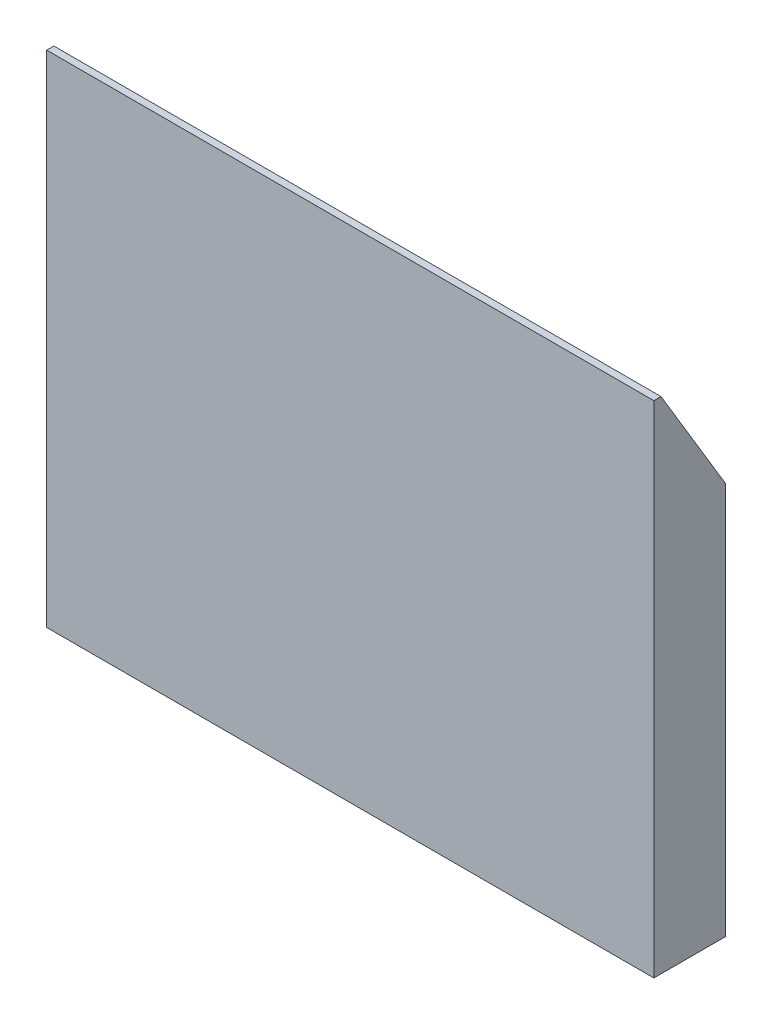
ISO-10303-21;
HEADER;
FILE_DESCRIPTION(('STEP AP214'),'2;1');
FILE_NAME('part.step','',(''),(''),'','','');
FILE_SCHEMA(('AUTOMOTIVE_DESIGN { 1 0 10303 214 1 1 1 1 }'));
ENDSEC;
DATA;
#1=APPLICATION_CONTEXT('core data for automotive mechanical design processes');
#2=APPLICATION_PROTOCOL_DEFINITION('international standard','automotive_design',2000,#1);
#3=PRODUCT_CONTEXT('',#1,'mechanical');
#4=PRODUCT('Part','Part','',(#3));
#5=PRODUCT_RELATED_PRODUCT_CATEGORY('part','',(#4));
#6=PRODUCT_DEFINITION_FORMATION('','',#4);
#7=PRODUCT_DEFINITION_CONTEXT('part definition',#1,'design');
#8=PRODUCT_DEFINITION('design','',#6,#7);
#9=PRODUCT_DEFINITION_SHAPE('','',#8);
#10=(LENGTH_UNIT() NAMED_UNIT(*) SI_UNIT(.MILLI.,.METRE.));
#11=(NAMED_UNIT(*) PLANE_ANGLE_UNIT() SI_UNIT($,.RADIAN.));
#12=(NAMED_UNIT(*) SI_UNIT($,.STERADIAN.) SOLID_ANGLE_UNIT());
#13=UNCERTAINTY_MEASURE_WITH_UNIT(LENGTH_MEASURE(1.E-05),#10,'distance_accuracy_value','');
#14=(GEOMETRIC_REPRESENTATION_CONTEXT(3) GLOBAL_UNCERTAINTY_ASSIGNED_CONTEXT((#13)) GLOBAL_UNIT_ASSIGNED_CONTEXT((#10,
#11,#12)) REPRESENTATION_CONTEXT('',''));
#15=CARTESIAN_POINT('',(0.,0.,0.));
#16=DIRECTION('',(0.,0.,1.));
#17=DIRECTION('',(1.,0.,0.));
#18=AXIS2_PLACEMENT_3D('',#15,#16,#17);
#19=CARTESIAN_POINT('',(41.5,70.,-10.));
#20=DIRECTION('',(1.,0.,0.));
#21=DIRECTION('',(0.,0.,-1.));
#22=AXIS2_PLACEMENT_3D('',#19,#20,#21);
#23=PLANE('',#22);
#24=DIRECTION('',(0.,-1.,0.));
#25=VECTOR('',#24,1.);
#26=CARTESIAN_POINT('',(41.5,70.,-1.00000000000001));
#27=LINE('',#26,#25);
#28=CARTESIAN_POINT('',(41.5,70.,-1.00000000000001));
#29=VERTEX_POINT('',#28);
#30=CARTESIAN_POINT('',(41.5,0.,-1.00000000000001));
#31=VERTEX_POINT('',#30);
#32=EDGE_CURVE('E47',#29,#31,#27,.T.);
#33=ORIENTED_EDGE('',*,*,#32,.F.);
#34=DIRECTION('',(0.,-0.857492925712544,-0.514495755427526));
#35=VECTOR('',#34,1.);
#36=CARTESIAN_POINT('',(41.5,66.0294117647059,-3.38235294117647));
#37=LINE('',#36,#35);
#38=CARTESIAN_POINT('',(41.5,55.,-10.));
#39=VERTEX_POINT('',#38);
#40=EDGE_CURVE('E102',#29,#39,#37,.T.);
#41=ORIENTED_EDGE('',*,*,#40,.T.);
#42=DIRECTION('',(0.,-1.,0.));
#43=VECTOR('',#42,1.);
#44=CARTESIAN_POINT('',(41.5,70.,-10.));
#45=LINE('',#44,#43);
#46=CARTESIAN_POINT('',(41.5,0.,-10.));
#47=VERTEX_POINT('',#46);
#48=EDGE_CURVE('E96',#39,#47,#45,.T.);
#49=ORIENTED_EDGE('',*,*,#48,.T.);
#50=DIRECTION('',(0.,0.,1.));
#51=VECTOR('',#50,1.);
#52=CARTESIAN_POINT('',(41.5,0.,-10.));
#53=LINE('',#52,#51);
#54=EDGE_CURVE('E142',#47,#31,#53,.T.);
#55=ORIENTED_EDGE('',*,*,#54,.T.);
#56=EDGE_LOOP('',(#33,#41,#49,#55));
#57=FACE_BOUND('',#56,.T.);
#58=ADVANCED_FACE('F39',(#57),#23,.F.);
#59=CARTESIAN_POINT('',(41.5,70.,-1.00000000000001));
#60=DIRECTION('',(0.,0.,1.));
#61=DIRECTION('',(1.,0.,0.));
#62=AXIS2_PLACEMENT_3D('',#59,#60,#61);
#63=PLANE('',#62);
#64=DIRECTION('',(-1.,0.,0.));
#65=VECTOR('',#64,1.);
#66=CARTESIAN_POINT('',(41.5,0.,-1.00000000000001));
#67=LINE('',#66,#65);
#68=CARTESIAN_POINT('',(-41.5,0.,-0.999999999999998));
#69=VERTEX_POINT('',#68);
#70=EDGE_CURVE('E145',#31,#69,#67,.T.);
#71=ORIENTED_EDGE('',*,*,#70,.T.);
#72=DIRECTION('',(0.,-1.,0.));
#73=VECTOR('',#72,1.);
#74=CARTESIAN_POINT('',(-41.5,70.,-0.999999999999998));
#75=LINE('',#74,#73);
#76=CARTESIAN_POINT('',(-41.5,70.,-1.));
#77=VERTEX_POINT('',#76);
#78=EDGE_CURVE('E184',#77,#69,#75,.T.);
#79=ORIENTED_EDGE('',*,*,#78,.F.);
#80=DIRECTION('',(-1.,0.,0.));
#81=VECTOR('',#80,1.);
#82=CARTESIAN_POINT('',(41.5,70.,-1.00000000000001));
#83=LINE('',#82,#81);
#84=EDGE_CURVE('E167',#29,#77,#83,.T.);
#85=ORIENTED_EDGE('',*,*,#84,.F.);
#86=ORIENTED_EDGE('',*,*,#32,.T.);
#87=EDGE_LOOP('',(#71,#79,#85,#86));
#88=FACE_BOUND('',#87,.T.);
#89=ADVANCED_FACE('F191',(#88),#63,.F.);
#90=CARTESIAN_POINT('',(-41.5,70.,-0.999999999999998));
#91=DIRECTION('',(-1.,0.,0.));
#92=DIRECTION('',(0.,0.,1.));
#93=AXIS2_PLACEMENT_3D('',#90,#91,#92);
#94=PLANE('',#93);
#95=DIRECTION('',(0.,-1.,0.));
#96=VECTOR('',#95,1.);
#97=CARTESIAN_POINT('',(-41.5,70.,-10.));
#98=LINE('',#97,#96);
#99=CARTESIAN_POINT('',(-41.5,55.,-10.));
#100=VERTEX_POINT('',#99);
#101=CARTESIAN_POINT('',(-41.5,0.,-10.));
#102=VERTEX_POINT('',#101);
#103=EDGE_CURVE('E181',#100,#102,#98,.T.);
#104=ORIENTED_EDGE('',*,*,#103,.F.);
#105=DIRECTION('',(0.,0.857492925712544,0.514495755427526));
#106=VECTOR('',#105,1.);
#107=CARTESIAN_POINT('',(-41.5,70.,-0.999999999999998));
#108=LINE('',#107,#106);
#109=EDGE_CURVE('E205',#100,#77,#108,.T.);
#110=ORIENTED_EDGE('',*,*,#109,.T.);
#111=ORIENTED_EDGE('',*,*,#78,.T.);
#112=DIRECTION('',(0.,0.,-1.));
#113=VECTOR('',#112,1.);
#114=CARTESIAN_POINT('',(-41.5,0.,-0.999999999999998));
#115=LINE('',#114,#113);
#116=EDGE_CURVE('E148',#69,#102,#115,.T.);
#117=ORIENTED_EDGE('',*,*,#116,.T.);
#118=EDGE_LOOP('',(#104,#110,#111,#117));
#119=FACE_BOUND('',#118,.T.);
#120=ADVANCED_FACE('F203',(#119),#94,.F.);
#121=CARTESIAN_POINT('',(-41.5,70.,-10.));
#122=DIRECTION('',(0.,0.,1.));
#123=DIRECTION('',(1.,0.,0.));
#124=AXIS2_PLACEMENT_3D('',#121,#122,#123);
#125=PLANE('',#124);
#126=DIRECTION('',(0.,-1.,0.));
#127=VECTOR('',#126,1.);
#128=CARTESIAN_POINT('',(-42.5,70.,-10.));
#129=LINE('',#128,#127);
#130=CARTESIAN_POINT('',(-42.5,55.,-10.));
#131=VERTEX_POINT('',#130);
#132=CARTESIAN_POINT('',(-42.5,0.,-10.));
#133=VERTEX_POINT('',#132);
#134=EDGE_CURVE('E178',#131,#133,#129,.T.);
#135=ORIENTED_EDGE('',*,*,#134,.F.);
#136=DIRECTION('',(1.,0.,0.));
#137=VECTOR('',#136,1.);
#138=CARTESIAN_POINT('',(-42.5,55.,-10.));
#139=LINE('',#138,#137);
#140=EDGE_CURVE('E208',#131,#100,#139,.T.);
#141=ORIENTED_EDGE('',*,*,#140,.T.);
#142=ORIENTED_EDGE('',*,*,#103,.T.);
#143=DIRECTION('',(-1.,0.,0.));
#144=VECTOR('',#143,1.);
#145=CARTESIAN_POINT('',(-41.5,0.,-10.));
#146=LINE('',#145,#144);
#147=EDGE_CURVE('E152',#102,#133,#146,.T.);
#148=ORIENTED_EDGE('',*,*,#147,.T.);
#149=EDGE_LOOP('',(#135,#141,#142,#148));
#150=FACE_BOUND('',#149,.T.);
#151=ADVANCED_FACE('F229',(#150),#125,.F.);
#152=CARTESIAN_POINT('',(-42.5,70.,-10.));
#153=DIRECTION('',(1.,0.,0.));
#154=DIRECTION('',(0.,0.,-1.));
#155=AXIS2_PLACEMENT_3D('',#152,#153,#154);
#156=PLANE('',#155);
#157=DIRECTION('',(0.,0.,1.));
#158=VECTOR('',#157,1.);
#159=CARTESIAN_POINT('',(-42.5,70.,-10.));
#160=LINE('',#159,#158);
#161=CARTESIAN_POINT('',(-42.5,70.,-0.999999999999999));
#162=VERTEX_POINT('',#161);
#163=CARTESIAN_POINT('',(-42.5,70.,0.));
#164=VERTEX_POINT('',#163);
#165=EDGE_CURVE('E138',#162,#164,#160,.T.);
#166=ORIENTED_EDGE('',*,*,#165,.F.);
#167=DIRECTION('',(0.,-0.857492925712544,-0.514495755427526));
#168=VECTOR('',#167,1.);
#169=CARTESIAN_POINT('',(-42.5,70.,-1.));
#170=LINE('',#169,#168);
#171=EDGE_CURVE('E54',#162,#131,#170,.T.);
#172=ORIENTED_EDGE('',*,*,#171,.T.);
#173=ORIENTED_EDGE('',*,*,#134,.T.);
#174=DIRECTION('',(0.,0.,1.));
#175=VECTOR('',#174,1.);
#176=CARTESIAN_POINT('',(-42.5,0.,-10.));
#177=LINE('',#176,#175);
#178=CARTESIAN_POINT('',(-42.5,0.,0.));
#179=VERTEX_POINT('',#178);
#180=EDGE_CURVE('E156',#133,#179,#177,.T.);
#181=ORIENTED_EDGE('',*,*,#180,.T.);
#182=DIRECTION('',(0.,-1.,0.));
#183=VECTOR('',#182,1.);
#184=CARTESIAN_POINT('',(-42.5,70.,0.));
#185=LINE('',#184,#183);
#186=EDGE_CURVE('E174',#164,#179,#185,.T.);
#187=ORIENTED_EDGE('',*,*,#186,.F.);
#188=EDGE_LOOP('',(#166,#172,#173,#181,#187));
#189=FACE_BOUND('',#188,.T.);
#190=ADVANCED_FACE('F226',(#189),#156,.F.);
#191=CARTESIAN_POINT('',(-42.5,70.,0.));
#192=DIRECTION('',(0.,0.,-1.));
#193=DIRECTION('',(-1.,0.,0.));
#194=AXIS2_PLACEMENT_3D('',#191,#192,#193);
#195=PLANE('',#194);
#196=DIRECTION('',(1.,0.,0.));
#197=VECTOR('',#196,1.);
#198=CARTESIAN_POINT('',(-42.5,0.,0.));
#199=LINE('',#198,#197);
#200=CARTESIAN_POINT('',(42.5,0.,0.));
#201=VERTEX_POINT('',#200);
#202=EDGE_CURVE('E159',#179,#201,#199,.T.);
#203=ORIENTED_EDGE('',*,*,#202,.T.);
#204=DIRECTION('',(0.,-1.,0.));
#205=VECTOR('',#204,1.);
#206=CARTESIAN_POINT('',(42.5,70.,0.));
#207=LINE('',#206,#205);
#208=CARTESIAN_POINT('',(42.5,70.,0.));
#209=VERTEX_POINT('',#208);
#210=EDGE_CURVE('E171',#209,#201,#207,.T.);
#211=ORIENTED_EDGE('',*,*,#210,.F.);
#212=DIRECTION('',(1.,0.,0.));
#213=VECTOR('',#212,1.);
#214=CARTESIAN_POINT('',(-42.5,70.,0.));
#215=LINE('',#214,#213);
#216=EDGE_CURVE('E63',#164,#209,#215,.T.);
#217=ORIENTED_EDGE('',*,*,#216,.F.);
#218=ORIENTED_EDGE('',*,*,#186,.T.);
#219=EDGE_LOOP('',(#203,#211,#217,#218));
#220=FACE_BOUND('',#219,.T.);
#221=ADVANCED_FACE('F232',(#220),#195,.F.);
#222=CARTESIAN_POINT('',(42.5,70.,0.));
#223=DIRECTION('',(-1.,0.,0.));
#224=DIRECTION('',(0.,0.,1.));
#225=AXIS2_PLACEMENT_3D('',#222,#223,#224);
#226=PLANE('',#225);
#227=DIRECTION('',(0.,-1.,0.));
#228=VECTOR('',#227,1.);
#229=CARTESIAN_POINT('',(42.5,70.,-10.));
#230=LINE('',#229,#228);
#231=CARTESIAN_POINT('',(42.5,55.,-10.));
#232=VERTEX_POINT('',#231);
#233=CARTESIAN_POINT('',(42.5,0.,-10.));
#234=VERTEX_POINT('',#233);
#235=EDGE_CURVE('E129',#232,#234,#230,.T.);
#236=ORIENTED_EDGE('',*,*,#235,.F.);
#237=DIRECTION('',(0.,-0.857492925712544,-0.514495755427526));
#238=VECTOR('',#237,1.);
#239=CARTESIAN_POINT('',(42.5,70.,-1.));
#240=LINE('',#239,#238);
#241=CARTESIAN_POINT('',(42.5,70.,-1.));
#242=VERTEX_POINT('',#241);
#243=EDGE_CURVE('E118',#242,#232,#240,.T.);
#244=ORIENTED_EDGE('',*,*,#243,.F.);
#245=DIRECTION('',(0.,0.,-1.));
#246=VECTOR('',#245,1.);
#247=CARTESIAN_POINT('',(42.5,70.,0.));
#248=LINE('',#247,#246);
#249=EDGE_CURVE('E127',#209,#242,#248,.T.);
#250=ORIENTED_EDGE('',*,*,#249,.F.);
#251=ORIENTED_EDGE('',*,*,#210,.T.);
#252=DIRECTION('',(0.,0.,-1.));
#253=VECTOR('',#252,1.);
#254=CARTESIAN_POINT('',(42.5,0.,0.));
#255=LINE('',#254,#253);
#256=EDGE_CURVE('E162',#201,#234,#255,.T.);
#257=ORIENTED_EDGE('',*,*,#256,.T.);
#258=EDGE_LOOP('',(#236,#244,#250,#251,#257));
#259=FACE_BOUND('',#258,.T.);
#260=ADVANCED_FACE('F125',(#259),#226,.F.);
#261=CARTESIAN_POINT('',(42.5,70.,-10.));
#262=DIRECTION('',(0.,0.,1.));
#263=DIRECTION('',(1.,0.,0.));
#264=AXIS2_PLACEMENT_3D('',#261,#262,#263);
#265=PLANE('',#264);
#266=ORIENTED_EDGE('',*,*,#48,.F.);
#267=EDGE_CURVE('E220',#39,#232,#139,.T.);
#268=ORIENTED_EDGE('',*,*,#267,.T.);
#269=ORIENTED_EDGE('',*,*,#235,.T.);
#270=DIRECTION('',(-1.,0.,0.));
#271=VECTOR('',#270,1.);
#272=CARTESIAN_POINT('',(42.5,0.,-10.));
#273=LINE('',#272,#271);
#274=EDGE_CURVE('E165',#234,#47,#273,.T.);
#275=ORIENTED_EDGE('',*,*,#274,.T.);
#276=EDGE_LOOP('',(#266,#268,#269,#275));
#277=FACE_BOUND('',#276,.T.);
#278=ADVANCED_FACE('F239',(#277),#265,.F.);
#279=CARTESIAN_POINT('',(0.,70.,0.));
#280=DIRECTION('',(0.,-1.,0.));
#281=DIRECTION('',(0.,0.,-1.));
#282=AXIS2_PLACEMENT_3D('',#279,#280,#281);
#283=PLANE('',#282);
#284=ORIENTED_EDGE('',*,*,#249,.T.);
#285=DIRECTION('',(-1.,0.,0.));
#286=VECTOR('',#285,1.);
#287=CARTESIAN_POINT('',(0.,70.,-1.));
#288=LINE('',#287,#286);
#289=EDGE_CURVE('E11',#242,#29,#288,.T.);
#290=ORIENTED_EDGE('',*,*,#289,.T.);
#291=ORIENTED_EDGE('',*,*,#84,.T.);
#292=DIRECTION('',(1.,0.,0.));
#293=VECTOR('',#292,1.);
#294=CARTESIAN_POINT('',(-42.5,70.,-1.));
#295=LINE('',#294,#293);
#296=EDGE_CURVE('E210',#162,#77,#295,.T.);
#297=ORIENTED_EDGE('',*,*,#296,.F.);
#298=ORIENTED_EDGE('',*,*,#165,.T.);
#299=ORIENTED_EDGE('',*,*,#216,.T.);
#300=EDGE_LOOP('',(#284,#290,#291,#297,#298,#299));
#301=FACE_BOUND('',#300,.T.);
#302=ADVANCED_FACE('F132',(#301),#283,.F.);
#303=CARTESIAN_POINT('',(0.,0.,0.));
#304=DIRECTION('',(0.,-1.,0.));
#305=DIRECTION('',(0.,0.,-1.));
#306=AXIS2_PLACEMENT_3D('',#303,#304,#305);
#307=PLANE('',#306);
#308=ORIENTED_EDGE('',*,*,#54,.F.);
#309=ORIENTED_EDGE('',*,*,#274,.F.);
#310=ORIENTED_EDGE('',*,*,#256,.F.);
#311=ORIENTED_EDGE('',*,*,#202,.F.);
#312=ORIENTED_EDGE('',*,*,#180,.F.);
#313=ORIENTED_EDGE('',*,*,#147,.F.);
#314=ORIENTED_EDGE('',*,*,#116,.F.);
#315=ORIENTED_EDGE('',*,*,#70,.F.);
#316=EDGE_LOOP('',(#308,#309,#310,#311,#312,#313,#314,#315));
#317=FACE_BOUND('',#316,.T.);
#318=ADVANCED_FACE('F196',(#317),#307,.T.);
#319=CARTESIAN_POINT('',(-42.5,70.,-1.));
#320=DIRECTION('',(0.,-0.514495755427526,0.857492925712544));
#321=DIRECTION('',(0.,-0.857492925712544,-0.514495755427526));
#322=AXIS2_PLACEMENT_3D('',#319,#320,#321);
#323=PLANE('',#322);
#324=ORIENTED_EDGE('',*,*,#140,.F.);
#325=ORIENTED_EDGE('',*,*,#171,.F.);
#326=ORIENTED_EDGE('',*,*,#296,.T.);
#327=ORIENTED_EDGE('',*,*,#109,.F.);
#328=EDGE_LOOP('',(#324,#325,#326,#327));
#329=FACE_BOUND('',#328,.T.);
#330=ADVANCED_FACE('F291',(#329),#323,.F.);
#331=ORIENTED_EDGE('',*,*,#289,.F.);
#332=ORIENTED_EDGE('',*,*,#243,.T.);
#333=ORIENTED_EDGE('',*,*,#267,.F.);
#334=ORIENTED_EDGE('',*,*,#40,.F.);
#335=EDGE_LOOP('',(#331,#332,#333,#334));
#336=FACE_BOUND('',#335,.T.);
#337=ADVANCED_FACE('F117',(#336),#323,.F.);
#338=CLOSED_SHELL('',(#58,#89,#120,#151,#190,#221,#260,#278,#302,#318,#330,#337));
#339=MANIFOLD_SOLID_BREP('B2',#338);
#340=ADVANCED_BREP_SHAPE_REPRESENTATION('',(#18,#339),#14);
#341=SHAPE_DEFINITION_REPRESENTATION(#9,#340);
ENDSEC;
END-ISO-10303-21;
